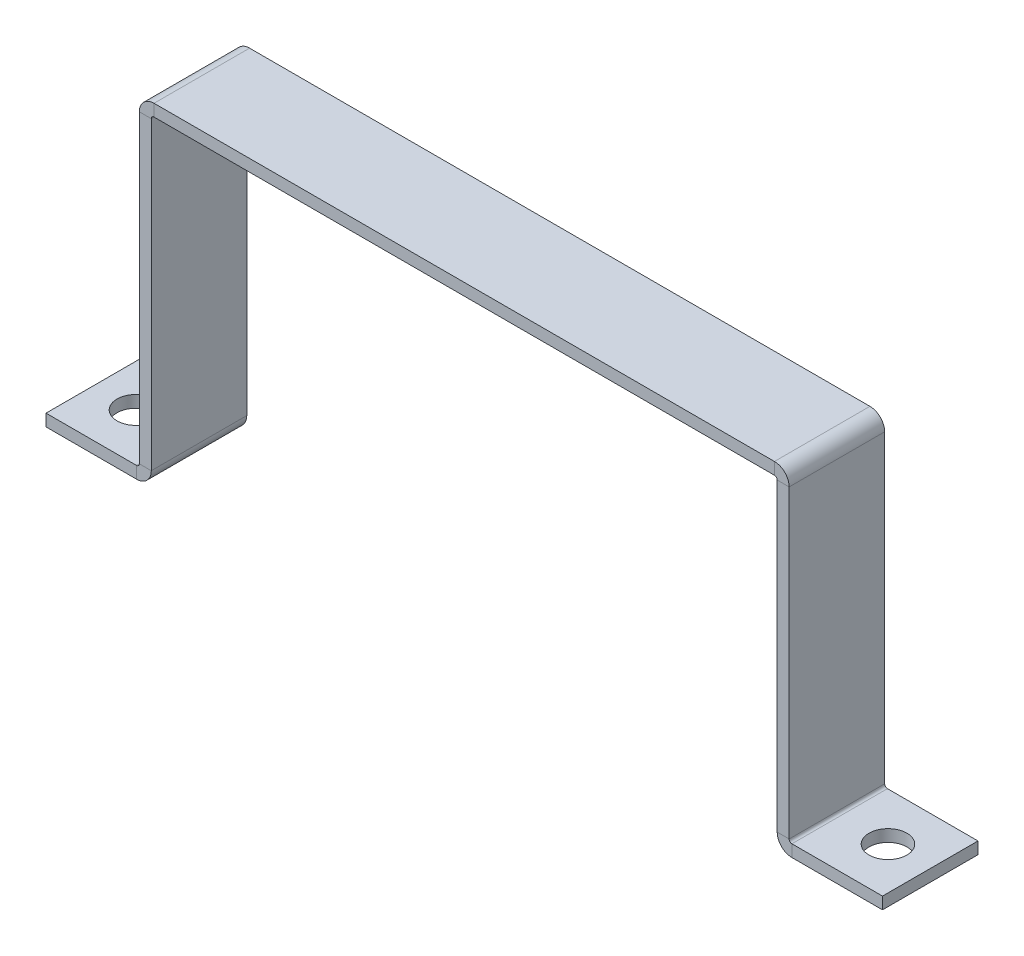
ISO-10303-21;
HEADER;
FILE_DESCRIPTION(('STEP AP214'),'2;1');
FILE_NAME('part.step','',(''),(''),'','','');
FILE_SCHEMA(('AUTOMOTIVE_DESIGN { 1 0 10303 214 1 1 1 1 }'));
ENDSEC;
DATA;
#1=APPLICATION_CONTEXT('core data for automotive mechanical design processes');
#2=APPLICATION_PROTOCOL_DEFINITION('international standard','automotive_design',2000,#1);
#3=PRODUCT_CONTEXT('',#1,'mechanical');
#4=PRODUCT('Part','Part','',(#3));
#5=PRODUCT_RELATED_PRODUCT_CATEGORY('part','',(#4));
#6=PRODUCT_DEFINITION_FORMATION('','',#4);
#7=PRODUCT_DEFINITION_CONTEXT('part definition',#1,'design');
#8=PRODUCT_DEFINITION('design','',#6,#7);
#9=PRODUCT_DEFINITION_SHAPE('','',#8);
#10=(LENGTH_UNIT() NAMED_UNIT(*) SI_UNIT(.MILLI.,.METRE.));
#11=(NAMED_UNIT(*) PLANE_ANGLE_UNIT() SI_UNIT($,.RADIAN.));
#12=(NAMED_UNIT(*) SI_UNIT($,.STERADIAN.) SOLID_ANGLE_UNIT());
#13=UNCERTAINTY_MEASURE_WITH_UNIT(LENGTH_MEASURE(1.E-05),#10,'distance_accuracy_value','');
#14=(GEOMETRIC_REPRESENTATION_CONTEXT(3) GLOBAL_UNCERTAINTY_ASSIGNED_CONTEXT((#13)) GLOBAL_UNIT_ASSIGNED_CONTEXT((#10,
#11,#12)) REPRESENTATION_CONTEXT('',''));
#15=CARTESIAN_POINT('',(0.,0.,0.));
#16=DIRECTION('',(0.,0.,1.));
#17=DIRECTION('',(1.,0.,0.));
#18=AXIS2_PLACEMENT_3D('',#15,#16,#17);
#19=CARTESIAN_POINT('',(-76.0798872180451,-3.175,25.4));
#20=DIRECTION('',(0.,1.,0.));
#21=DIRECTION('',(0.,0.,1.));
#22=AXIS2_PLACEMENT_3D('',#19,#20,#21);
#23=PLANE('',#22);
#24=DIRECTION('',(1.,0.,0.));
#25=VECTOR('',#24,1.);
#26=CARTESIAN_POINT('',(-76.0798872180451,-3.175,0.));
#27=LINE('',#26,#25);
#28=CARTESIAN_POINT('',(-76.0798872180451,-3.175,0.));
#29=VERTEX_POINT('',#28);
#30=CARTESIAN_POINT('',(88.9201127819549,-3.175,0.));
#31=VERTEX_POINT('',#30);
#32=EDGE_CURVE('E221',#29,#31,#27,.T.);
#33=ORIENTED_EDGE('',*,*,#32,.T.);
#34=DIRECTION('',(0.,0.,-1.));
#35=VECTOR('',#34,1.);
#36=CARTESIAN_POINT('',(88.9201127819549,-3.175,25.4));
#37=LINE('',#36,#35);
#38=CARTESIAN_POINT('',(88.9201127819549,-3.175,25.4));
#39=VERTEX_POINT('',#38);
#40=EDGE_CURVE('E13',#39,#31,#37,.T.);
#41=ORIENTED_EDGE('',*,*,#40,.F.);
#42=DIRECTION('',(1.,0.,0.));
#43=VECTOR('',#42,1.);
#44=CARTESIAN_POINT('',(-76.0798872180451,-3.175,25.4));
#45=LINE('',#44,#43);
#46=CARTESIAN_POINT('',(-76.0798872180451,-3.175,25.4));
#47=VERTEX_POINT('',#46);
#48=EDGE_CURVE('E136',#47,#39,#45,.T.);
#49=ORIENTED_EDGE('',*,*,#48,.F.);
#50=DIRECTION('',(0.,0.,-1.));
#51=VECTOR('',#50,1.);
#52=CARTESIAN_POINT('',(-76.0798872180451,-3.175,25.4));
#53=LINE('',#52,#51);
#54=EDGE_CURVE('E234',#47,#29,#53,.T.);
#55=ORIENTED_EDGE('',*,*,#54,.T.);
#56=EDGE_LOOP('',(#33,#41,#49,#55));
#57=FACE_BOUND('',#56,.T.);
#58=ADVANCED_FACE('F120',(#57),#23,.F.);
#59=CARTESIAN_POINT('',(-76.0798872180451,0.,25.4));
#60=DIRECTION('',(0.,1.,0.));
#61=DIRECTION('',(0.,0.,1.));
#62=AXIS2_PLACEMENT_3D('',#59,#60,#61);
#63=PLANE('',#62);
#64=DIRECTION('',(1.,0.,0.));
#65=VECTOR('',#64,1.);
#66=CARTESIAN_POINT('',(-76.0798872180451,0.,0.));
#67=LINE('',#66,#65);
#68=CARTESIAN_POINT('',(-76.0798872180451,0.,0.));
#69=VERTEX_POINT('',#68);
#70=CARTESIAN_POINT('',(88.9201127819549,0.,0.));
#71=VERTEX_POINT('',#70);
#72=EDGE_CURVE('E240',#69,#71,#67,.T.);
#73=ORIENTED_EDGE('',*,*,#72,.F.);
#74=DIRECTION('',(0.,0.,-1.));
#75=VECTOR('',#74,1.);
#76=CARTESIAN_POINT('',(-76.0798872180451,0.,25.4));
#77=LINE('',#76,#75);
#78=CARTESIAN_POINT('',(-76.0798872180451,0.,25.4));
#79=VERTEX_POINT('',#78);
#80=EDGE_CURVE('E246',#79,#69,#77,.T.);
#81=ORIENTED_EDGE('',*,*,#80,.F.);
#82=DIRECTION('',(1.,0.,0.));
#83=VECTOR('',#82,1.);
#84=CARTESIAN_POINT('',(-76.0798872180451,0.,25.4));
#85=LINE('',#84,#83);
#86=CARTESIAN_POINT('',(88.9201127819549,0.,25.4));
#87=VERTEX_POINT('',#86);
#88=EDGE_CURVE('E228',#79,#87,#85,.T.);
#89=ORIENTED_EDGE('',*,*,#88,.T.);
#90=DIRECTION('',(0.,0.,-1.));
#91=VECTOR('',#90,1.);
#92=CARTESIAN_POINT('',(88.9201127819549,0.,25.4));
#93=LINE('',#92,#91);
#94=EDGE_CURVE('E128',#87,#71,#93,.T.);
#95=ORIENTED_EDGE('',*,*,#94,.T.);
#96=EDGE_LOOP('',(#73,#81,#89,#95));
#97=FACE_BOUND('',#96,.T.);
#98=ADVANCED_FACE('F250',(#97),#63,.T.);
#99=CARTESIAN_POINT('',(0.,0.,25.4));
#100=DIRECTION('',(0.,0.,-1.));
#101=DIRECTION('',(-1.,0.,0.));
#102=AXIS2_PLACEMENT_3D('',#99,#100,#101);
#103=PLANE('',#102);
#104=ORIENTED_EDGE('',*,*,#48,.T.);
#105=DIRECTION('',(0.,-1.,0.));
#106=VECTOR('',#105,1.);
#107=CARTESIAN_POINT('',(88.9201127819549,0.,25.4));
#108=LINE('',#107,#106);
#109=EDGE_CURVE('E192',#87,#39,#108,.T.);
#110=ORIENTED_EDGE('',*,*,#109,.F.);
#111=ORIENTED_EDGE('',*,*,#88,.F.);
#112=DIRECTION('',(0.,1.,0.));
#113=VECTOR('',#112,1.);
#114=CARTESIAN_POINT('',(-76.0798872180451,-3.175,25.4));
#115=LINE('',#114,#113);
#116=EDGE_CURVE('E231',#47,#79,#115,.T.);
#117=ORIENTED_EDGE('',*,*,#116,.F.);
#118=EDGE_LOOP('',(#104,#110,#111,#117));
#119=FACE_BOUND('',#118,.T.);
#120=ADVANCED_FACE('F337',(#119),#103,.F.);
#121=CARTESIAN_POINT('',(0.,0.,0.));
#122=DIRECTION('',(0.,0.,-1.));
#123=DIRECTION('',(-1.,0.,0.));
#124=AXIS2_PLACEMENT_3D('',#121,#122,#123);
#125=PLANE('',#124);
#126=ORIENTED_EDGE('',*,*,#32,.F.);
#127=DIRECTION('',(0.,1.,0.));
#128=VECTOR('',#127,1.);
#129=CARTESIAN_POINT('',(-76.0798872180451,-3.175,0.));
#130=LINE('',#129,#128);
#131=EDGE_CURVE('E226',#29,#69,#130,.T.);
#132=ORIENTED_EDGE('',*,*,#131,.T.);
#133=ORIENTED_EDGE('',*,*,#72,.T.);
#134=DIRECTION('',(0.,-1.,0.));
#135=VECTOR('',#134,1.);
#136=CARTESIAN_POINT('',(88.9201127819549,0.,0.));
#137=LINE('',#136,#135);
#138=EDGE_CURVE('E237',#71,#31,#137,.T.);
#139=ORIENTED_EDGE('',*,*,#138,.T.);
#140=EDGE_LOOP('',(#126,#132,#133,#139));
#141=FACE_BOUND('',#140,.T.);
#142=ADVANCED_FACE('F255',(#141),#125,.T.);
#143=CARTESIAN_POINT('',(88.9201127819549,-3.9116,0.));
#144=DIRECTION('',(0.,0.,-1.));
#145=DIRECTION('',(-1.,0.,0.));
#146=AXIS2_PLACEMENT_3D('',#143,#144,#145);
#147=PLANE('',#146);
#148=DIRECTION('',(-1.,0.,0.));
#149=VECTOR('',#148,1.);
#150=CARTESIAN_POINT('',(92.8317127819549,-3.91159999999999,0.));
#151=LINE('',#150,#149);
#152=CARTESIAN_POINT('',(89.6567127819549,-3.9116,0.));
#153=VERTEX_POINT('',#152);
#154=CARTESIAN_POINT('',(92.8317127819549,-3.91159999999999,0.));
#155=VERTEX_POINT('',#154);
#156=EDGE_CURVE('E183',#153,#155,#151,.F.);
#157=ORIENTED_EDGE('',*,*,#156,.F.);
#158=CARTESIAN_POINT('',(88.9201127819549,-3.9116,0.));
#159=DIRECTION('',(0.,0.,1.));
#160=DIRECTION('',(1.,0.,0.));
#161=AXIS2_PLACEMENT_3D('',#158,#159,#160);
#162=CIRCLE('',#161,0.736600000000004);
#163=EDGE_CURVE('E177',#31,#153,#162,.F.);
#164=ORIENTED_EDGE('',*,*,#163,.F.);
#165=ORIENTED_EDGE('',*,*,#138,.F.);
#166=CARTESIAN_POINT('',(88.9201127819549,-3.9116,0.));
#167=DIRECTION('',(0.,0.,1.));
#168=DIRECTION('',(1.,0.,0.));
#169=AXIS2_PLACEMENT_3D('',#166,#167,#168);
#170=CIRCLE('',#169,3.9116);
#171=EDGE_CURVE('E148',#71,#155,#170,.F.);
#172=ORIENTED_EDGE('',*,*,#171,.T.);
#173=EDGE_LOOP('',(#157,#164,#165,#172));
#174=FACE_BOUND('',#173,.T.);
#175=ADVANCED_FACE('F339',(#174),#147,.T.);
#176=CARTESIAN_POINT('',(88.9201127819549,-3.9116,25.4));
#177=DIRECTION('',(0.,0.,-1.));
#178=DIRECTION('',(-1.,0.,0.));
#179=AXIS2_PLACEMENT_3D('',#176,#177,#178);
#180=PLANE('',#179);
#181=CARTESIAN_POINT('',(88.9201127819549,-3.9116,25.4));
#182=DIRECTION('',(0.,0.,1.));
#183=DIRECTION('',(1.,0.,0.));
#184=AXIS2_PLACEMENT_3D('',#181,#182,#183);
#185=CIRCLE('',#184,0.736600000000004);
#186=CARTESIAN_POINT('',(89.6567127819549,-3.9116,25.4));
#187=VERTEX_POINT('',#186);
#188=EDGE_CURVE('E175',#187,#39,#185,.T.);
#189=ORIENTED_EDGE('',*,*,#188,.F.);
#190=DIRECTION('',(-1.,0.,0.));
#191=VECTOR('',#190,1.);
#192=CARTESIAN_POINT('',(89.6567127819549,-3.9116,25.4));
#193=LINE('',#192,#191);
#194=CARTESIAN_POINT('',(92.8317127819549,-3.91159999999999,25.4));
#195=VERTEX_POINT('',#194);
#196=EDGE_CURVE('E182',#187,#195,#193,.F.);
#197=ORIENTED_EDGE('',*,*,#196,.T.);
#198=CARTESIAN_POINT('',(88.9201127819549,-3.9116,25.4));
#199=DIRECTION('',(0.,0.,1.));
#200=DIRECTION('',(1.,0.,0.));
#201=AXIS2_PLACEMENT_3D('',#198,#199,#200);
#202=CIRCLE('',#201,3.9116);
#203=EDGE_CURVE('E222',#195,#87,#202,.T.);
#204=ORIENTED_EDGE('',*,*,#203,.T.);
#205=ORIENTED_EDGE('',*,*,#109,.T.);
#206=EDGE_LOOP('',(#189,#197,#204,#205));
#207=FACE_BOUND('',#206,.T.);
#208=ADVANCED_FACE('F188',(#207),#180,.F.);
#209=CARTESIAN_POINT('',(88.9201127819549,-3.9116,25.4));
#210=DIRECTION('',(0.,0.,1.));
#211=DIRECTION('',(1.,0.,0.));
#212=AXIS2_PLACEMENT_3D('',#209,#210,#211);
#213=CYLINDRICAL_SURFACE('',#212,3.9116);
#214=ORIENTED_EDGE('',*,*,#94,.F.);
#215=ORIENTED_EDGE('',*,*,#203,.F.);
#216=DIRECTION('',(0.,0.,1.));
#217=VECTOR('',#216,1.);
#218=CARTESIAN_POINT('',(92.8317127819549,-3.91159999999999,0.));
#219=LINE('',#218,#217);
#220=EDGE_CURVE('E205',#195,#155,#219,.F.);
#221=ORIENTED_EDGE('',*,*,#220,.T.);
#222=ORIENTED_EDGE('',*,*,#171,.F.);
#223=EDGE_LOOP('',(#214,#215,#221,#222));
#224=FACE_BOUND('',#223,.T.);
#225=ADVANCED_FACE('F335',(#224),#213,.T.);
#226=CARTESIAN_POINT('',(88.9201127819549,-3.9116,25.4));
#227=DIRECTION('',(0.,0.,1.));
#228=DIRECTION('',(1.,0.,0.));
#229=AXIS2_PLACEMENT_3D('',#226,#227,#228);
#230=CYLINDRICAL_SURFACE('',#229,0.736600000000004);
#231=ORIENTED_EDGE('',*,*,#40,.T.);
#232=ORIENTED_EDGE('',*,*,#163,.T.);
#233=DIRECTION('',(0.,0.,1.));
#234=VECTOR('',#233,1.);
#235=CARTESIAN_POINT('',(89.6567127819549,-3.9116,0.));
#236=LINE('',#235,#234);
#237=EDGE_CURVE('E172',#153,#187,#236,.T.);
#238=ORIENTED_EDGE('',*,*,#237,.T.);
#239=ORIENTED_EDGE('',*,*,#188,.T.);
#240=EDGE_LOOP('',(#231,#232,#238,#239));
#241=FACE_BOUND('',#240,.T.);
#242=ADVANCED_FACE('F174',(#241),#230,.F.);
#243=CARTESIAN_POINT('',(92.8317127819552,-85.,25.4));
#244=DIRECTION('',(0.,0.,-1.));
#245=DIRECTION('',(0.,1.,0.));
#246=AXIS2_PLACEMENT_3D('',#243,#244,#245);
#247=PLANE('',#246);
#248=ORIENTED_EDGE('',*,*,#196,.F.);
#249=DIRECTION('',(0.,1.,0.));
#250=VECTOR('',#249,1.);
#251=CARTESIAN_POINT('',(89.6567127819552,-85.,25.4));
#252=LINE('',#251,#250);
#253=CARTESIAN_POINT('',(89.6567127819552,-85.,25.4));
#254=VERTEX_POINT('',#253);
#255=EDGE_CURVE('E201',#187,#254,#252,.F.);
#256=ORIENTED_EDGE('',*,*,#255,.T.);
#257=DIRECTION('',(-1.,0.,0.));
#258=VECTOR('',#257,1.);
#259=CARTESIAN_POINT('',(92.8317127819552,-85.,25.4));
#260=LINE('',#259,#258);
#261=CARTESIAN_POINT('',(92.8317127819552,-85.,25.4));
#262=VERTEX_POINT('',#261);
#263=EDGE_CURVE('E193',#262,#254,#260,.T.);
#264=ORIENTED_EDGE('',*,*,#263,.F.);
#265=DIRECTION('',(0.,-1.,0.));
#266=VECTOR('',#265,1.);
#267=CARTESIAN_POINT('',(92.8317127819549,3.21327553858895E-13,25.4));
#268=LINE('',#267,#266);
#269=EDGE_CURVE('E204',#195,#262,#268,.T.);
#270=ORIENTED_EDGE('',*,*,#269,.F.);
#271=EDGE_LOOP('',(#248,#256,#264,#270));
#272=FACE_BOUND('',#271,.T.);
#273=ADVANCED_FACE('F198',(#272),#247,.F.);
#274=CARTESIAN_POINT('',(92.8317127819549,-3.17499999999999,0.));
#275=DIRECTION('',(0.,0.,1.));
#276=DIRECTION('',(1.,0.,0.));
#277=AXIS2_PLACEMENT_3D('',#274,#275,#276);
#278=PLANE('',#277);
#279=ORIENTED_EDGE('',*,*,#156,.T.);
#280=DIRECTION('',(0.,1.,0.));
#281=VECTOR('',#280,1.);
#282=CARTESIAN_POINT('',(92.8317127819549,3.27789438557676E-13,0.));
#283=LINE('',#282,#281);
#284=CARTESIAN_POINT('',(92.8317127819552,-85.,0.));
#285=VERTEX_POINT('',#284);
#286=EDGE_CURVE('E291',#285,#155,#283,.T.);
#287=ORIENTED_EDGE('',*,*,#286,.F.);
#288=DIRECTION('',(-1.,0.,0.));
#289=VECTOR('',#288,1.);
#290=CARTESIAN_POINT('',(92.8317127819552,-85.,0.));
#291=LINE('',#290,#289);
#292=CARTESIAN_POINT('',(89.6567127819552,-85.,0.));
#293=VERTEX_POINT('',#292);
#294=EDGE_CURVE('E288',#285,#293,#291,.T.);
#295=ORIENTED_EDGE('',*,*,#294,.T.);
#296=DIRECTION('',(0.,-1.,0.));
#297=VECTOR('',#296,1.);
#298=CARTESIAN_POINT('',(89.6567127819549,-3.175,0.));
#299=LINE('',#298,#297);
#300=EDGE_CURVE('E212',#293,#153,#299,.F.);
#301=ORIENTED_EDGE('',*,*,#300,.T.);
#302=EDGE_LOOP('',(#279,#287,#295,#301));
#303=FACE_BOUND('',#302,.T.);
#304=ADVANCED_FACE('F298',(#303),#278,.F.);
#305=CARTESIAN_POINT('',(92.8317127819549,3.27789438557676E-13,0.));
#306=DIRECTION('',(-1.,0.,0.));
#307=DIRECTION('',(0.,-1.,0.));
#308=AXIS2_PLACEMENT_3D('',#305,#306,#307);
#309=PLANE('',#308);
#310=ORIENTED_EDGE('',*,*,#220,.F.);
#311=ORIENTED_EDGE('',*,*,#269,.T.);
#312=DIRECTION('',(0.,0.,-1.));
#313=VECTOR('',#312,1.);
#314=CARTESIAN_POINT('',(92.8317127819552,-85.,0.));
#315=LINE('',#314,#313);
#316=EDGE_CURVE('E294',#262,#285,#315,.T.);
#317=ORIENTED_EDGE('',*,*,#316,.T.);
#318=ORIENTED_EDGE('',*,*,#286,.T.);
#319=EDGE_LOOP('',(#310,#311,#317,#318));
#320=FACE_BOUND('',#319,.T.);
#321=ADVANCED_FACE('F456',(#320),#309,.F.);
#322=CARTESIAN_POINT('',(89.6567127819549,3.16703985306849E-13,0.));
#323=DIRECTION('',(-1.,0.,0.));
#324=DIRECTION('',(0.,-1.,0.));
#325=AXIS2_PLACEMENT_3D('',#322,#323,#324);
#326=PLANE('',#325);
#327=ORIENTED_EDGE('',*,*,#255,.F.);
#328=ORIENTED_EDGE('',*,*,#237,.F.);
#329=ORIENTED_EDGE('',*,*,#300,.F.);
#330=DIRECTION('',(0.,0.,1.));
#331=VECTOR('',#330,1.);
#332=CARTESIAN_POINT('',(89.6567127819552,-85.,0.));
#333=LINE('',#332,#331);
#334=EDGE_CURVE('E209',#254,#293,#333,.F.);
#335=ORIENTED_EDGE('',*,*,#334,.F.);
#336=EDGE_LOOP('',(#327,#328,#329,#335));
#337=FACE_BOUND('',#336,.T.);
#338=ADVANCED_FACE('F207',(#337),#326,.T.);
#339=CARTESIAN_POINT('',(-76.0798872180451,-3.9116,25.4));
#340=DIRECTION('',(0.,0.,1.));
#341=DIRECTION('',(1.,0.,0.));
#342=AXIS2_PLACEMENT_3D('',#339,#340,#341);
#343=PLANE('',#342);
#344=DIRECTION('',(1.,0.,0.));
#345=VECTOR('',#344,1.);
#346=CARTESIAN_POINT('',(-79.9914872180451,-3.91159999999999,25.4));
#347=LINE('',#346,#345);
#348=CARTESIAN_POINT('',(-76.8164872180451,-3.9116,25.4));
#349=VERTEX_POINT('',#348);
#350=CARTESIAN_POINT('',(-79.9914872180451,-3.91159999999999,25.4));
#351=VERTEX_POINT('',#350);
#352=EDGE_CURVE('E839',#349,#351,#347,.F.);
#353=ORIENTED_EDGE('',*,*,#352,.F.);
#354=CARTESIAN_POINT('',(-76.0798872180451,-3.9116,25.4));
#355=DIRECTION('',(0.,0.,-1.));
#356=DIRECTION('',(-1.,0.,0.));
#357=AXIS2_PLACEMENT_3D('',#354,#355,#356);
#358=CIRCLE('',#357,0.736600000000004);
#359=EDGE_CURVE('E278',#47,#349,#358,.F.);
#360=ORIENTED_EDGE('',*,*,#359,.F.);
#361=ORIENTED_EDGE('',*,*,#116,.T.);
#362=CARTESIAN_POINT('',(-76.0798872180451,-3.9116,25.4));
#363=DIRECTION('',(0.,0.,-1.));
#364=DIRECTION('',(-1.,0.,0.));
#365=AXIS2_PLACEMENT_3D('',#362,#363,#364);
#366=CIRCLE('',#365,3.9116);
#367=EDGE_CURVE('E219',#79,#351,#366,.F.);
#368=ORIENTED_EDGE('',*,*,#367,.T.);
#369=EDGE_LOOP('',(#353,#360,#361,#368));
#370=FACE_BOUND('',#369,.T.);
#371=ADVANCED_FACE('F400',(#370),#343,.T.);
#372=CARTESIAN_POINT('',(-76.0798872180451,-3.9116,0.));
#373=DIRECTION('',(0.,0.,1.));
#374=DIRECTION('',(1.,0.,0.));
#375=AXIS2_PLACEMENT_3D('',#372,#373,#374);
#376=PLANE('',#375);
#377=CARTESIAN_POINT('',(-76.0798872180451,-3.9116,0.));
#378=DIRECTION('',(0.,0.,-1.));
#379=DIRECTION('',(-1.,0.,0.));
#380=AXIS2_PLACEMENT_3D('',#377,#378,#379);
#381=CIRCLE('',#380,0.736600000000004);
#382=CARTESIAN_POINT('',(-76.8164872180451,-3.9116,0.));
#383=VERTEX_POINT('',#382);
#384=EDGE_CURVE('E266',#383,#29,#381,.T.);
#385=ORIENTED_EDGE('',*,*,#384,.F.);
#386=DIRECTION('',(1.,0.,0.));
#387=VECTOR('',#386,1.);
#388=CARTESIAN_POINT('',(-76.8164872180451,-3.9116,0.));
#389=LINE('',#388,#387);
#390=CARTESIAN_POINT('',(-79.9914872180451,-3.91159999999999,0.));
#391=VERTEX_POINT('',#390);
#392=EDGE_CURVE('E867',#383,#391,#389,.F.);
#393=ORIENTED_EDGE('',*,*,#392,.T.);
#394=CARTESIAN_POINT('',(-76.0798872180451,-3.9116,0.));
#395=DIRECTION('',(0.,0.,-1.));
#396=DIRECTION('',(-1.,0.,0.));
#397=AXIS2_PLACEMENT_3D('',#394,#395,#396);
#398=CIRCLE('',#397,3.9116);
#399=EDGE_CURVE('E269',#391,#69,#398,.T.);
#400=ORIENTED_EDGE('',*,*,#399,.T.);
#401=ORIENTED_EDGE('',*,*,#131,.F.);
#402=EDGE_LOOP('',(#385,#393,#400,#401));
#403=FACE_BOUND('',#402,.T.);
#404=ADVANCED_FACE('F263',(#403),#376,.F.);
#405=CARTESIAN_POINT('',(-76.0798872180451,-3.9116,0.));
#406=DIRECTION('',(0.,0.,-1.));
#407=DIRECTION('',(-1.,0.,0.));
#408=AXIS2_PLACEMENT_3D('',#405,#406,#407);
#409=CYLINDRICAL_SURFACE('',#408,3.9116);
#410=ORIENTED_EDGE('',*,*,#80,.T.);
#411=ORIENTED_EDGE('',*,*,#399,.F.);
#412=DIRECTION('',(0.,0.,-1.));
#413=VECTOR('',#412,1.);
#414=CARTESIAN_POINT('',(-79.9914872180451,-3.91159999999999,25.4));
#415=LINE('',#414,#413);
#416=EDGE_CURVE('E865',#391,#351,#415,.F.);
#417=ORIENTED_EDGE('',*,*,#416,.T.);
#418=ORIENTED_EDGE('',*,*,#367,.F.);
#419=EDGE_LOOP('',(#410,#411,#417,#418));
#420=FACE_BOUND('',#419,.T.);
#421=ADVANCED_FACE('F417',(#420),#409,.T.);
#422=CARTESIAN_POINT('',(-76.0798872180451,-3.9116,0.));
#423=DIRECTION('',(0.,0.,-1.));
#424=DIRECTION('',(-1.,0.,0.));
#425=AXIS2_PLACEMENT_3D('',#422,#423,#424);
#426=CYLINDRICAL_SURFACE('',#425,0.736600000000004);
#427=ORIENTED_EDGE('',*,*,#54,.F.);
#428=ORIENTED_EDGE('',*,*,#359,.T.);
#429=DIRECTION('',(0.,0.,-1.));
#430=VECTOR('',#429,1.);
#431=CARTESIAN_POINT('',(-76.8164872180451,-3.9116,25.4));
#432=LINE('',#431,#430);
#433=EDGE_CURVE('E277',#349,#383,#432,.T.);
#434=ORIENTED_EDGE('',*,*,#433,.T.);
#435=ORIENTED_EDGE('',*,*,#384,.T.);
#436=EDGE_LOOP('',(#427,#428,#434,#435));
#437=FACE_BOUND('',#436,.T.);
#438=ADVANCED_FACE('F273',(#437),#426,.F.);
#439=CARTESIAN_POINT('',(-79.9914872180451,-3.17499999999999,25.4));
#440=DIRECTION('',(0.,0.,-1.));
#441=DIRECTION('',(-1.,0.,0.));
#442=AXIS2_PLACEMENT_3D('',#439,#440,#441);
#443=PLANE('',#442);
#444=ORIENTED_EDGE('',*,*,#352,.T.);
#445=DIRECTION('',(0.,1.,0.));
#446=VECTOR('',#445,1.);
#447=CARTESIAN_POINT('',(-79.9914872180451,2.82056808659861E-13,25.4));
#448=LINE('',#447,#446);
#449=CARTESIAN_POINT('',(-79.9914872180454,-85.,25.4));
#450=VERTEX_POINT('',#449);
#451=EDGE_CURVE('E854',#450,#351,#448,.T.);
#452=ORIENTED_EDGE('',*,*,#451,.F.);
#453=DIRECTION('',(1.,0.,0.));
#454=VECTOR('',#453,1.);
#455=CARTESIAN_POINT('',(-79.9914872180454,-85.,25.4));
#456=LINE('',#455,#454);
#457=CARTESIAN_POINT('',(-76.8164872180454,-85.,25.4));
#458=VERTEX_POINT('',#457);
#459=EDGE_CURVE('E283',#450,#458,#456,.T.);
#460=ORIENTED_EDGE('',*,*,#459,.T.);
#461=DIRECTION('',(0.,-1.,0.));
#462=VECTOR('',#461,1.);
#463=CARTESIAN_POINT('',(-76.8164872180451,-3.175,25.4));
#464=LINE('',#463,#462);
#465=EDGE_CURVE('E862',#458,#349,#464,.F.);
#466=ORIENTED_EDGE('',*,*,#465,.T.);
#467=EDGE_LOOP('',(#444,#452,#460,#466));
#468=FACE_BOUND('',#467,.T.);
#469=ADVANCED_FACE('F437',(#468),#443,.F.);
#470=CARTESIAN_POINT('',(-79.9914872180454,-85.,0.));
#471=DIRECTION('',(0.,0.,1.));
#472=DIRECTION('',(1.,0.,0.));
#473=AXIS2_PLACEMENT_3D('',#470,#471,#472);
#474=PLANE('',#473);
#475=ORIENTED_EDGE('',*,*,#392,.F.);
#476=DIRECTION('',(0.,1.,0.));
#477=VECTOR('',#476,1.);
#478=CARTESIAN_POINT('',(-76.8164872180454,-85.,0.));
#479=LINE('',#478,#477);
#480=CARTESIAN_POINT('',(-76.8164872180454,-85.,0.));
#481=VERTEX_POINT('',#480);
#482=EDGE_CURVE('E860',#383,#481,#479,.F.);
#483=ORIENTED_EDGE('',*,*,#482,.T.);
#484=DIRECTION('',(1.,0.,0.));
#485=VECTOR('',#484,1.);
#486=CARTESIAN_POINT('',(-79.9914872180454,-85.,0.));
#487=LINE('',#486,#485);
#488=CARTESIAN_POINT('',(-79.9914872180454,-85.,0.));
#489=VERTEX_POINT('',#488);
#490=EDGE_CURVE('E279',#489,#481,#487,.T.);
#491=ORIENTED_EDGE('',*,*,#490,.F.);
#492=DIRECTION('',(0.,-1.,0.));
#493=VECTOR('',#492,1.);
#494=CARTESIAN_POINT('',(-79.9914872180451,2.82056808659861E-13,0.));
#495=LINE('',#494,#493);
#496=EDGE_CURVE('E852',#391,#489,#495,.T.);
#497=ORIENTED_EDGE('',*,*,#496,.F.);
#498=EDGE_LOOP('',(#475,#483,#491,#497));
#499=FACE_BOUND('',#498,.T.);
#500=ADVANCED_FACE('F481',(#499),#474,.F.);
#501=CARTESIAN_POINT('',(-79.9914872180451,2.82056808659861E-13,0.));
#502=DIRECTION('',(1.,0.,0.));
#503=DIRECTION('',(0.,1.,0.));
#504=AXIS2_PLACEMENT_3D('',#501,#502,#503);
#505=PLANE('',#504);
#506=ORIENTED_EDGE('',*,*,#416,.F.);
#507=ORIENTED_EDGE('',*,*,#496,.T.);
#508=DIRECTION('',(0.,0.,1.));
#509=VECTOR('',#508,1.);
#510=CARTESIAN_POINT('',(-79.9914872180454,-85.,0.));
#511=LINE('',#510,#509);
#512=EDGE_CURVE('E850',#489,#450,#511,.T.);
#513=ORIENTED_EDGE('',*,*,#512,.T.);
#514=ORIENTED_EDGE('',*,*,#451,.T.);
#515=EDGE_LOOP('',(#506,#507,#513,#514));
#516=FACE_BOUND('',#515,.T.);
#517=ADVANCED_FACE('F492',(#516),#505,.F.);
#518=CARTESIAN_POINT('',(-76.8164872180451,2.70971355409034E-13,0.));
#519=DIRECTION('',(1.,0.,0.));
#520=DIRECTION('',(0.,1.,0.));
#521=AXIS2_PLACEMENT_3D('',#518,#519,#520);
#522=PLANE('',#521);
#523=ORIENTED_EDGE('',*,*,#482,.F.);
#524=ORIENTED_EDGE('',*,*,#433,.F.);
#525=ORIENTED_EDGE('',*,*,#465,.F.);
#526=DIRECTION('',(0.,0.,-1.));
#527=VECTOR('',#526,1.);
#528=CARTESIAN_POINT('',(-76.8164872180454,-85.,25.4));
#529=LINE('',#528,#527);
#530=EDGE_CURVE('E857',#481,#458,#529,.F.);
#531=ORIENTED_EDGE('',*,*,#530,.F.);
#532=EDGE_LOOP('',(#523,#524,#525,#531));
#533=FACE_BOUND('',#532,.T.);
#534=ADVANCED_FACE('F503',(#533),#522,.T.);
#535=CARTESIAN_POINT('',(93.5683127819552,-85.,25.4));
#536=DIRECTION('',(0.,0.,1.));
#537=DIRECTION('',(1.,0.,0.));
#538=AXIS2_PLACEMENT_3D('',#535,#536,#537);
#539=PLANE('',#538);
#540=DIRECTION('',(0.,1.,0.));
#541=VECTOR('',#540,1.);
#542=CARTESIAN_POINT('',(93.5683127819552,-88.9116,25.4));
#543=LINE('',#542,#541);
#544=CARTESIAN_POINT('',(93.5683127819552,-85.7366,25.4));
#545=VERTEX_POINT('',#544);
#546=CARTESIAN_POINT('',(93.5683127819552,-88.9116,25.4));
#547=VERTEX_POINT('',#546);
#548=EDGE_CURVE('E793',#545,#547,#543,.F.);
#549=ORIENTED_EDGE('',*,*,#548,.F.);
#550=CARTESIAN_POINT('',(93.5683127819552,-85.,25.4));
#551=DIRECTION('',(0.,0.,-1.));
#552=DIRECTION('',(-1.,0.,0.));
#553=AXIS2_PLACEMENT_3D('',#550,#551,#552);
#554=CIRCLE('',#553,0.736600000000004);
#555=EDGE_CURVE('E843',#262,#545,#554,.F.);
#556=ORIENTED_EDGE('',*,*,#555,.F.);
#557=ORIENTED_EDGE('',*,*,#263,.T.);
#558=CARTESIAN_POINT('',(93.5683127819552,-85.,25.4));
#559=DIRECTION('',(0.,0.,-1.));
#560=DIRECTION('',(-1.,0.,0.));
#561=AXIS2_PLACEMENT_3D('',#558,#559,#560);
#562=CIRCLE('',#561,3.9116);
#563=EDGE_CURVE('E836',#254,#547,#562,.F.);
#564=ORIENTED_EDGE('',*,*,#563,.T.);
#565=EDGE_LOOP('',(#549,#556,#557,#564));
#566=FACE_BOUND('',#565,.T.);
#567=ADVANCED_FACE('F514',(#566),#539,.T.);
#568=CARTESIAN_POINT('',(93.5683127819552,-85.,0.));
#569=DIRECTION('',(0.,0.,1.));
#570=DIRECTION('',(1.,0.,0.));
#571=AXIS2_PLACEMENT_3D('',#568,#569,#570);
#572=PLANE('',#571);
#573=CARTESIAN_POINT('',(93.5683127819552,-85.,0.));
#574=DIRECTION('',(0.,0.,-1.));
#575=DIRECTION('',(-1.,0.,0.));
#576=AXIS2_PLACEMENT_3D('',#573,#574,#575);
#577=CIRCLE('',#576,0.736600000000004);
#578=CARTESIAN_POINT('',(93.5683127819552,-85.7366,0.));
#579=VERTEX_POINT('',#578);
#580=EDGE_CURVE('E805',#579,#285,#577,.T.);
#581=ORIENTED_EDGE('',*,*,#580,.F.);
#582=DIRECTION('',(0.,1.,0.));
#583=VECTOR('',#582,1.);
#584=CARTESIAN_POINT('',(93.5683127819552,-85.7366,0.));
#585=LINE('',#584,#583);
#586=CARTESIAN_POINT('',(93.5683127819552,-88.9116,0.));
#587=VERTEX_POINT('',#586);
#588=EDGE_CURVE('E829',#579,#587,#585,.F.);
#589=ORIENTED_EDGE('',*,*,#588,.T.);
#590=CARTESIAN_POINT('',(93.5683127819552,-85.,0.));
#591=DIRECTION('',(0.,0.,-1.));
#592=DIRECTION('',(-1.,0.,0.));
#593=AXIS2_PLACEMENT_3D('',#590,#591,#592);
#594=CIRCLE('',#593,3.9116);
#595=EDGE_CURVE('E840',#587,#293,#594,.T.);
#596=ORIENTED_EDGE('',*,*,#595,.T.);
#597=ORIENTED_EDGE('',*,*,#294,.F.);
#598=EDGE_LOOP('',(#581,#589,#596,#597));
#599=FACE_BOUND('',#598,.T.);
#600=ADVANCED_FACE('F525',(#599),#572,.F.);
#601=CARTESIAN_POINT('',(93.5683127819552,-85.,0.));
#602=DIRECTION('',(0.,0.,-1.));
#603=DIRECTION('',(0.,-1.,0.));
#604=AXIS2_PLACEMENT_3D('',#601,#602,#603);
#605=CYLINDRICAL_SURFACE('',#604,3.9116);
#606=ORIENTED_EDGE('',*,*,#334,.T.);
#607=ORIENTED_EDGE('',*,*,#595,.F.);
#608=DIRECTION('',(0.,0.,-1.));
#609=VECTOR('',#608,1.);
#610=CARTESIAN_POINT('',(93.5683127819552,-88.9116,25.4));
#611=LINE('',#610,#609);
#612=EDGE_CURVE('E827',#587,#547,#611,.F.);
#613=ORIENTED_EDGE('',*,*,#612,.T.);
#614=ORIENTED_EDGE('',*,*,#563,.F.);
#615=EDGE_LOOP('',(#606,#607,#613,#614));
#616=FACE_BOUND('',#615,.T.);
#617=ADVANCED_FACE('F536',(#616),#605,.T.);
#618=CARTESIAN_POINT('',(93.5683127819552,-85.,0.));
#619=DIRECTION('',(0.,0.,-1.));
#620=DIRECTION('',(0.,-1.,0.));
#621=AXIS2_PLACEMENT_3D('',#618,#619,#620);
#622=CYLINDRICAL_SURFACE('',#621,0.736600000000004);
#623=ORIENTED_EDGE('',*,*,#316,.F.);
#624=ORIENTED_EDGE('',*,*,#555,.T.);
#625=DIRECTION('',(0.,0.,-1.));
#626=VECTOR('',#625,1.);
#627=CARTESIAN_POINT('',(93.5683127819552,-85.7366,25.4));
#628=LINE('',#627,#626);
#629=EDGE_CURVE('E832',#545,#579,#628,.T.);
#630=ORIENTED_EDGE('',*,*,#629,.T.);
#631=ORIENTED_EDGE('',*,*,#580,.T.);
#632=EDGE_LOOP('',(#623,#624,#630,#631));
#633=FACE_BOUND('',#632,.T.);
#634=ADVANCED_FACE('F547',(#633),#622,.F.);
#635=CARTESIAN_POINT('',(117.656712781955,-88.9116,0.));
#636=DIRECTION('',(0.,0.,1.));
#637=DIRECTION('',(1.,0.,0.));
#638=AXIS2_PLACEMENT_3D('',#635,#636,#637);
#639=PLANE('',#638);
#640=ORIENTED_EDGE('',*,*,#588,.F.);
#641=DIRECTION('',(-1.,0.,0.));
#642=VECTOR('',#641,1.);
#643=CARTESIAN_POINT('',(117.656712781955,-85.7366,0.));
#644=LINE('',#643,#642);
#645=CARTESIAN_POINT('',(117.656712781955,-85.7366,0.));
#646=VERTEX_POINT('',#645);
#647=EDGE_CURVE('E824',#579,#646,#644,.F.);
#648=ORIENTED_EDGE('',*,*,#647,.T.);
#649=DIRECTION('',(0.,1.,0.));
#650=VECTOR('',#649,1.);
#651=CARTESIAN_POINT('',(117.656712781955,-88.9116,0.));
#652=LINE('',#651,#650);
#653=CARTESIAN_POINT('',(117.656712781955,-88.9116,0.));
#654=VERTEX_POINT('',#653);
#655=EDGE_CURVE('E802',#654,#646,#652,.T.);
#656=ORIENTED_EDGE('',*,*,#655,.F.);
#657=DIRECTION('',(1.,0.,0.));
#658=VECTOR('',#657,1.);
#659=CARTESIAN_POINT('',(0.,-88.9116,0.));
#660=LINE('',#659,#658);
#661=EDGE_CURVE('E815',#587,#654,#660,.T.);
#662=ORIENTED_EDGE('',*,*,#661,.F.);
#663=EDGE_LOOP('',(#640,#648,#656,#662));
#664=FACE_BOUND('',#663,.T.);
#665=ADVANCED_FACE('F558',(#664),#639,.F.);
#666=CARTESIAN_POINT('',(92.8317127819552,-88.9116,25.4));
#667=DIRECTION('',(0.,0.,-1.));
#668=DIRECTION('',(-1.,0.,0.));
#669=AXIS2_PLACEMENT_3D('',#666,#667,#668);
#670=PLANE('',#669);
#671=ORIENTED_EDGE('',*,*,#548,.T.);
#672=DIRECTION('',(-1.,0.,0.));
#673=VECTOR('',#672,1.);
#674=CARTESIAN_POINT('',(0.,-88.9116,25.4));
#675=LINE('',#674,#673);
#676=CARTESIAN_POINT('',(117.656712781955,-88.9116,25.4));
#677=VERTEX_POINT('',#676);
#678=EDGE_CURVE('E809',#677,#547,#675,.T.);
#679=ORIENTED_EDGE('',*,*,#678,.F.);
#680=DIRECTION('',(0.,1.,0.));
#681=VECTOR('',#680,1.);
#682=CARTESIAN_POINT('',(117.656712781955,-88.9116,25.4));
#683=LINE('',#682,#681);
#684=CARTESIAN_POINT('',(117.656712781955,-85.7366,25.4));
#685=VERTEX_POINT('',#684);
#686=EDGE_CURVE('E806',#677,#685,#683,.T.);
#687=ORIENTED_EDGE('',*,*,#686,.T.);
#688=DIRECTION('',(1.,0.,0.));
#689=VECTOR('',#688,1.);
#690=CARTESIAN_POINT('',(92.8317127819552,-85.7366,25.4));
#691=LINE('',#690,#689);
#692=EDGE_CURVE('E818',#685,#545,#691,.F.);
#693=ORIENTED_EDGE('',*,*,#692,.T.);
#694=EDGE_LOOP('',(#671,#679,#687,#693));
#695=FACE_BOUND('',#694,.T.);
#696=ADVANCED_FACE('F569',(#695),#670,.F.);
#697=CARTESIAN_POINT('',(0.,-88.9116,0.));
#698=DIRECTION('',(0.,1.,0.));
#699=DIRECTION('',(0.,0.,1.));
#700=AXIS2_PLACEMENT_3D('',#697,#698,#699);
#701=PLANE('',#700);
#702=CARTESIAN_POINT('',(106.413512781954,-88.9116,12.7));
#703=DIRECTION('',(0.,-1.,0.));
#704=DIRECTION('',(0.,0.,-1.));
#705=AXIS2_PLACEMENT_3D('',#702,#703,#704);
#706=CIRCLE('',#705,5.04189999999997);
#707=CARTESIAN_POINT('',(106.413512781954,-88.9116,7.65810000000004));
#708=VERTEX_POINT('',#707);
#709=EDGE_CURVE('E745',#708,#708,#706,.T.);
#710=ORIENTED_EDGE('',*,*,#709,.F.);
#711=EDGE_LOOP('',(#710));
#712=FACE_BOUND('',#711,.T.);
#713=ORIENTED_EDGE('',*,*,#612,.F.);
#714=ORIENTED_EDGE('',*,*,#661,.T.);
#715=DIRECTION('',(0.,0.,1.));
#716=VECTOR('',#715,1.);
#717=CARTESIAN_POINT('',(117.656712781955,-88.9116,0.));
#718=LINE('',#717,#716);
#719=EDGE_CURVE('E812',#654,#677,#718,.T.);
#720=ORIENTED_EDGE('',*,*,#719,.T.);
#721=ORIENTED_EDGE('',*,*,#678,.T.);
#722=EDGE_LOOP('',(#713,#714,#720,#721));
#723=FACE_BOUND('',#722,.T.);
#724=ADVANCED_FACE('F580',(#712,#723),#701,.F.);
#725=CARTESIAN_POINT('',(0.,-85.7366,0.));
#726=DIRECTION('',(0.,1.,0.));
#727=DIRECTION('',(0.,0.,1.));
#728=AXIS2_PLACEMENT_3D('',#725,#726,#727);
#729=PLANE('',#728);
#730=CARTESIAN_POINT('',(106.413512781954,-85.7366,12.7));
#731=DIRECTION('',(0.,1.,0.));
#732=DIRECTION('',(0.,0.,1.));
#733=AXIS2_PLACEMENT_3D('',#730,#731,#732);
#734=CIRCLE('',#733,5.04189999999997);
#735=CARTESIAN_POINT('',(106.413512781954,-85.7366,17.7419));
#736=VERTEX_POINT('',#735);
#737=EDGE_CURVE('E750',#736,#736,#734,.T.);
#738=ORIENTED_EDGE('',*,*,#737,.F.);
#739=EDGE_LOOP('',(#738));
#740=FACE_BOUND('',#739,.T.);
#741=ORIENTED_EDGE('',*,*,#647,.F.);
#742=ORIENTED_EDGE('',*,*,#629,.F.);
#743=ORIENTED_EDGE('',*,*,#692,.F.);
#744=DIRECTION('',(0.,0.,-1.));
#745=VECTOR('',#744,1.);
#746=CARTESIAN_POINT('',(117.656712781955,-85.7366,25.4));
#747=LINE('',#746,#745);
#748=EDGE_CURVE('E821',#646,#685,#747,.F.);
#749=ORIENTED_EDGE('',*,*,#748,.F.);
#750=EDGE_LOOP('',(#741,#742,#743,#749));
#751=FACE_BOUND('',#750,.T.);
#752=ADVANCED_FACE('F595',(#740,#751),#729,.T.);
#753=CARTESIAN_POINT('',(117.656712781955,-88.9116,25.4));
#754=DIRECTION('',(-1.,0.,0.));
#755=DIRECTION('',(0.,-1.,0.));
#756=AXIS2_PLACEMENT_3D('',#753,#754,#755);
#757=PLANE('',#756);
#758=ORIENTED_EDGE('',*,*,#748,.T.);
#759=ORIENTED_EDGE('',*,*,#686,.F.);
#760=ORIENTED_EDGE('',*,*,#719,.F.);
#761=ORIENTED_EDGE('',*,*,#655,.T.);
#762=EDGE_LOOP('',(#758,#759,#760,#761));
#763=FACE_BOUND('',#762,.T.);
#764=ADVANCED_FACE('F589',(#763),#757,.F.);
#765=CARTESIAN_POINT('',(-80.7280872180454,-85.,0.));
#766=DIRECTION('',(0.,0.,-1.));
#767=DIRECTION('',(-1.,0.,0.));
#768=AXIS2_PLACEMENT_3D('',#765,#766,#767);
#769=PLANE('',#768);
#770=DIRECTION('',(0.,1.,0.));
#771=VECTOR('',#770,1.);
#772=CARTESIAN_POINT('',(-80.7280872180454,-88.9116,0.));
#773=LINE('',#772,#771);
#774=CARTESIAN_POINT('',(-80.7280872180454,-85.7366,0.));
#775=VERTEX_POINT('',#774);
#776=CARTESIAN_POINT('',(-80.7280872180454,-88.9116,0.));
#777=VERTEX_POINT('',#776);
#778=EDGE_CURVE('E753',#775,#777,#773,.F.);
#779=ORIENTED_EDGE('',*,*,#778,.F.);
#780=CARTESIAN_POINT('',(-80.7280872180454,-85.,0.));
#781=DIRECTION('',(0.,0.,1.));
#782=DIRECTION('',(1.,0.,0.));
#783=AXIS2_PLACEMENT_3D('',#780,#781,#782);
#784=CIRCLE('',#783,0.736600000000004);
#785=EDGE_CURVE('E797',#489,#775,#784,.F.);
#786=ORIENTED_EDGE('',*,*,#785,.F.);
#787=ORIENTED_EDGE('',*,*,#490,.T.);
#788=CARTESIAN_POINT('',(-80.7280872180454,-85.,0.));
#789=DIRECTION('',(0.,0.,1.));
#790=DIRECTION('',(1.,0.,0.));
#791=AXIS2_PLACEMENT_3D('',#788,#789,#790);
#792=CIRCLE('',#791,3.9116);
#793=EDGE_CURVE('E790',#481,#777,#792,.F.);
#794=ORIENTED_EDGE('',*,*,#793,.T.);
#795=EDGE_LOOP('',(#779,#786,#787,#794));
#796=FACE_BOUND('',#795,.T.);
#797=ADVANCED_FACE('F594',(#796),#769,.T.);
#798=CARTESIAN_POINT('',(-80.7280872180454,-85.,25.4));
#799=DIRECTION('',(0.,0.,-1.));
#800=DIRECTION('',(-1.,0.,0.));
#801=AXIS2_PLACEMENT_3D('',#798,#799,#800);
#802=PLANE('',#801);
#803=CARTESIAN_POINT('',(-80.7280872180454,-85.,25.4));
#804=DIRECTION('',(0.,0.,1.));
#805=DIRECTION('',(1.,0.,0.));
#806=AXIS2_PLACEMENT_3D('',#803,#804,#805);
#807=CIRCLE('',#806,0.736600000000004);
#808=CARTESIAN_POINT('',(-80.7280872180454,-85.7366,25.4));
#809=VERTEX_POINT('',#808);
#810=EDGE_CURVE('E757',#809,#450,#807,.T.);
#811=ORIENTED_EDGE('',*,*,#810,.F.);
#812=DIRECTION('',(0.,1.,0.));
#813=VECTOR('',#812,1.);
#814=CARTESIAN_POINT('',(-80.7280872180454,-85.7366,25.4));
#815=LINE('',#814,#813);
#816=CARTESIAN_POINT('',(-80.7280872180454,-88.9116,25.4));
#817=VERTEX_POINT('',#816);
#818=EDGE_CURVE('E782',#809,#817,#815,.F.);
#819=ORIENTED_EDGE('',*,*,#818,.T.);
#820=CARTESIAN_POINT('',(-80.7280872180454,-85.,25.4));
#821=DIRECTION('',(0.,0.,1.));
#822=DIRECTION('',(1.,0.,0.));
#823=AXIS2_PLACEMENT_3D('',#820,#821,#822);
#824=CIRCLE('',#823,3.9116);
#825=EDGE_CURVE('E794',#817,#458,#824,.T.);
#826=ORIENTED_EDGE('',*,*,#825,.T.);
#827=ORIENTED_EDGE('',*,*,#459,.F.);
#828=EDGE_LOOP('',(#811,#819,#826,#827));
#829=FACE_BOUND('',#828,.T.);
#830=ADVANCED_FACE('F608',(#829),#802,.F.);
#831=CARTESIAN_POINT('',(-80.7280872180454,-85.,25.4));
#832=DIRECTION('',(0.,0.,1.));
#833=DIRECTION('',(0.,-1.,0.));
#834=AXIS2_PLACEMENT_3D('',#831,#832,#833);
#835=CYLINDRICAL_SURFACE('',#834,3.9116);
#836=ORIENTED_EDGE('',*,*,#530,.T.);
#837=ORIENTED_EDGE('',*,*,#825,.F.);
#838=DIRECTION('',(0.,0.,1.));
#839=VECTOR('',#838,1.);
#840=CARTESIAN_POINT('',(-80.7280872180454,-88.9116,0.));
#841=LINE('',#840,#839);
#842=EDGE_CURVE('E779',#817,#777,#841,.F.);
#843=ORIENTED_EDGE('',*,*,#842,.T.);
#844=ORIENTED_EDGE('',*,*,#793,.F.);
#845=EDGE_LOOP('',(#836,#837,#843,#844));
#846=FACE_BOUND('',#845,.T.);
#847=ADVANCED_FACE('F619',(#846),#835,.T.);
#848=CARTESIAN_POINT('',(-80.7280872180454,-85.,25.4));
#849=DIRECTION('',(0.,0.,1.));
#850=DIRECTION('',(0.,-1.,0.));
#851=AXIS2_PLACEMENT_3D('',#848,#849,#850);
#852=CYLINDRICAL_SURFACE('',#851,0.736600000000004);
#853=ORIENTED_EDGE('',*,*,#512,.F.);
#854=ORIENTED_EDGE('',*,*,#785,.T.);
#855=DIRECTION('',(0.,0.,1.));
#856=VECTOR('',#855,1.);
#857=CARTESIAN_POINT('',(-80.7280872180454,-85.7366,0.));
#858=LINE('',#857,#856);
#859=EDGE_CURVE('E785',#775,#809,#858,.T.);
#860=ORIENTED_EDGE('',*,*,#859,.T.);
#861=ORIENTED_EDGE('',*,*,#810,.T.);
#862=EDGE_LOOP('',(#853,#854,#860,#861));
#863=FACE_BOUND('',#862,.T.);
#864=ADVANCED_FACE('F630',(#863),#852,.F.);
#865=CARTESIAN_POINT('',(-79.9914872180454,-88.9116,0.));
#866=DIRECTION('',(0.,0.,1.));
#867=DIRECTION('',(1.,0.,0.));
#868=AXIS2_PLACEMENT_3D('',#865,#866,#867);
#869=PLANE('',#868);
#870=ORIENTED_EDGE('',*,*,#778,.T.);
#871=DIRECTION('',(1.,0.,0.));
#872=VECTOR('',#871,1.);
#873=CARTESIAN_POINT('',(0.,-88.9116,0.));
#874=LINE('',#873,#872);
#875=CARTESIAN_POINT('',(-104.816487218045,-88.9116,0.));
#876=VERTEX_POINT('',#875);
#877=EDGE_CURVE('E767',#876,#777,#874,.T.);
#878=ORIENTED_EDGE('',*,*,#877,.F.);
#879=DIRECTION('',(0.,1.,0.));
#880=VECTOR('',#879,1.);
#881=CARTESIAN_POINT('',(-104.816487218045,-88.9116,0.));
#882=LINE('',#881,#880);
#883=CARTESIAN_POINT('',(-104.816487218045,-85.7366,0.));
#884=VERTEX_POINT('',#883);
#885=EDGE_CURVE('E758',#876,#884,#882,.T.);
#886=ORIENTED_EDGE('',*,*,#885,.T.);
#887=DIRECTION('',(-1.,0.,0.));
#888=VECTOR('',#887,1.);
#889=CARTESIAN_POINT('',(-79.9914872180454,-85.7366,0.));
#890=LINE('',#889,#888);
#891=EDGE_CURVE('E776',#884,#775,#890,.F.);
#892=ORIENTED_EDGE('',*,*,#891,.T.);
#893=EDGE_LOOP('',(#870,#878,#886,#892));
#894=FACE_BOUND('',#893,.T.);
#895=ADVANCED_FACE('F641',(#894),#869,.F.);
#896=CARTESIAN_POINT('',(-104.816487218045,-88.9116,25.4));
#897=DIRECTION('',(0.,0.,-1.));
#898=DIRECTION('',(-1.,0.,0.));
#899=AXIS2_PLACEMENT_3D('',#896,#897,#898);
#900=PLANE('',#899);
#901=ORIENTED_EDGE('',*,*,#818,.F.);
#902=DIRECTION('',(1.,0.,0.));
#903=VECTOR('',#902,1.);
#904=CARTESIAN_POINT('',(-104.816487218045,-85.7366,25.4));
#905=LINE('',#904,#903);
#906=CARTESIAN_POINT('',(-104.816487218045,-85.7366,25.4));
#907=VERTEX_POINT('',#906);
#908=EDGE_CURVE('E773',#809,#907,#905,.F.);
#909=ORIENTED_EDGE('',*,*,#908,.T.);
#910=DIRECTION('',(0.,1.,0.));
#911=VECTOR('',#910,1.);
#912=CARTESIAN_POINT('',(-104.816487218045,-88.9116,25.4));
#913=LINE('',#912,#911);
#914=CARTESIAN_POINT('',(-104.816487218045,-88.9116,25.4));
#915=VERTEX_POINT('',#914);
#916=EDGE_CURVE('E754',#915,#907,#913,.T.);
#917=ORIENTED_EDGE('',*,*,#916,.F.);
#918=DIRECTION('',(-1.,0.,0.));
#919=VECTOR('',#918,1.);
#920=CARTESIAN_POINT('',(0.,-88.9116,25.4));
#921=LINE('',#920,#919);
#922=EDGE_CURVE('E764',#817,#915,#921,.T.);
#923=ORIENTED_EDGE('',*,*,#922,.F.);
#924=EDGE_LOOP('',(#901,#909,#917,#923));
#925=FACE_BOUND('',#924,.T.);
#926=ADVANCED_FACE('F652',(#925),#900,.F.);
#927=CARTESIAN_POINT('',(0.,-88.9116,0.));
#928=DIRECTION('',(0.,1.,0.));
#929=DIRECTION('',(0.,0.,1.));
#930=AXIS2_PLACEMENT_3D('',#927,#928,#929);
#931=PLANE('',#930);
#932=CARTESIAN_POINT('',(-93.5864872180457,-88.9116,12.7));
#933=DIRECTION('',(0.,-1.,0.));
#934=DIRECTION('',(0.,0.,-1.));
#935=AXIS2_PLACEMENT_3D('',#932,#933,#934);
#936=CIRCLE('',#935,5.04189999999997);
#937=CARTESIAN_POINT('',(-93.5864872180457,-88.9116,7.65810000000002));
#938=VERTEX_POINT('',#937);
#939=EDGE_CURVE('E743',#938,#938,#936,.T.);
#940=ORIENTED_EDGE('',*,*,#939,.F.);
#941=EDGE_LOOP('',(#940));
#942=FACE_BOUND('',#941,.T.);
#943=ORIENTED_EDGE('',*,*,#842,.F.);
#944=ORIENTED_EDGE('',*,*,#922,.T.);
#945=DIRECTION('',(0.,0.,-1.));
#946=VECTOR('',#945,1.);
#947=CARTESIAN_POINT('',(-104.816487218045,-88.9116,0.));
#948=LINE('',#947,#946);
#949=EDGE_CURVE('E761',#915,#876,#948,.T.);
#950=ORIENTED_EDGE('',*,*,#949,.T.);
#951=ORIENTED_EDGE('',*,*,#877,.T.);
#952=EDGE_LOOP('',(#943,#944,#950,#951));
#953=FACE_BOUND('',#952,.T.);
#954=ADVANCED_FACE('F663',(#942,#953),#931,.F.);
#955=CARTESIAN_POINT('',(0.,-85.7366,0.));
#956=DIRECTION('',(0.,1.,0.));
#957=DIRECTION('',(0.,0.,1.));
#958=AXIS2_PLACEMENT_3D('',#955,#956,#957);
#959=PLANE('',#958);
#960=CARTESIAN_POINT('',(-93.5864872180457,-85.7366,12.7));
#961=DIRECTION('',(0.,1.,0.));
#962=DIRECTION('',(0.,0.,1.));
#963=AXIS2_PLACEMENT_3D('',#960,#961,#962);
#964=CIRCLE('',#963,5.04189999999997);
#965=CARTESIAN_POINT('',(-93.5864872180457,-85.7366,17.7419));
#966=VERTEX_POINT('',#965);
#967=EDGE_CURVE('E740',#966,#966,#964,.T.);
#968=ORIENTED_EDGE('',*,*,#967,.F.);
#969=EDGE_LOOP('',(#968));
#970=FACE_BOUND('',#969,.T.);
#971=ORIENTED_EDGE('',*,*,#908,.F.);
#972=ORIENTED_EDGE('',*,*,#859,.F.);
#973=ORIENTED_EDGE('',*,*,#891,.F.);
#974=DIRECTION('',(0.,0.,1.));
#975=VECTOR('',#974,1.);
#976=CARTESIAN_POINT('',(-104.816487218045,-85.7366,0.));
#977=LINE('',#976,#975);
#978=EDGE_CURVE('E770',#907,#884,#977,.F.);
#979=ORIENTED_EDGE('',*,*,#978,.F.);
#980=EDGE_LOOP('',(#971,#972,#973,#979));
#981=FACE_BOUND('',#980,.T.);
#982=ADVANCED_FACE('F678',(#970,#981),#959,.T.);
#983=CARTESIAN_POINT('',(-104.816487218045,-88.9116,0.));
#984=DIRECTION('',(1.,0.,0.));
#985=DIRECTION('',(0.,1.,0.));
#986=AXIS2_PLACEMENT_3D('',#983,#984,#985);
#987=PLANE('',#986);
#988=ORIENTED_EDGE('',*,*,#978,.T.);
#989=ORIENTED_EDGE('',*,*,#885,.F.);
#990=ORIENTED_EDGE('',*,*,#949,.F.);
#991=ORIENTED_EDGE('',*,*,#916,.T.);
#992=EDGE_LOOP('',(#988,#989,#990,#991));
#993=FACE_BOUND('',#992,.T.);
#994=ADVANCED_FACE('F672',(#993),#987,.F.);
#995=CARTESIAN_POINT('',(106.413512781954,-88.9116,12.7));
#996=DIRECTION('',(0.,-1.,0.));
#997=DIRECTION('',(0.,0.,-1.));
#998=AXIS2_PLACEMENT_3D('',#995,#996,#997);
#999=CYLINDRICAL_SURFACE('',#998,5.04189999999997);
#1000=ORIENTED_EDGE('',*,*,#737,.T.);
#1001=EDGE_LOOP('',(#1000));
#1002=FACE_BOUND('',#1001,.T.);
#1003=ORIENTED_EDGE('',*,*,#709,.T.);
#1004=EDGE_LOOP('',(#1003));
#1005=FACE_BOUND('',#1004,.T.);
#1006=ADVANCED_FACE('F677',(#1002,#1005),#999,.F.);
#1007=CARTESIAN_POINT('',(-93.5864872180457,-88.9116,12.7));
#1008=DIRECTION('',(0.,-1.,0.));
#1009=DIRECTION('',(0.,0.,-1.));
#1010=AXIS2_PLACEMENT_3D('',#1007,#1008,#1009);
#1011=CYLINDRICAL_SURFACE('',#1010,5.04189999999997);
#1012=ORIENTED_EDGE('',*,*,#967,.T.);
#1013=EDGE_LOOP('',(#1012));
#1014=FACE_BOUND('',#1013,.T.);
#1015=ORIENTED_EDGE('',*,*,#939,.T.);
#1016=EDGE_LOOP('',(#1015));
#1017=FACE_BOUND('',#1016,.T.);
#1018=ADVANCED_FACE('F723',(#1014,#1017),#1011,.F.);
#1019=CLOSED_SHELL('',(#58,#98,#120,#142,#175,#208,#225,#242,#273,#304,#321,#338,#371,#404,#421,
#438,#469,#500,#517,#534,#567,#600,#617,#634,#665,#696,#724,#752,#764,#797,#830,#847,#864,#895,
#926,#954,#982,#994,#1006,#1018));
#1020=MANIFOLD_SOLID_BREP('B2',#1019);
#1021=ADVANCED_BREP_SHAPE_REPRESENTATION('',(#18,#1020),#14);
#1022=SHAPE_DEFINITION_REPRESENTATION(#9,#1021);
ENDSEC;
END-ISO-10303-21;
